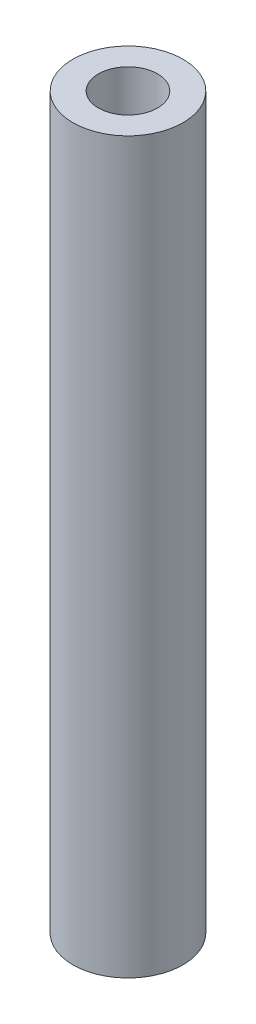
ISO-10303-21;
HEADER;
FILE_DESCRIPTION(('STEP AP214'),'2;1');
FILE_NAME('part.step','',(''),(''),'','','');
FILE_SCHEMA(('AUTOMOTIVE_DESIGN { 1 0 10303 214 1 1 1 1 }'));
ENDSEC;
DATA;
#1=APPLICATION_CONTEXT('core data for automotive mechanical design processes');
#2=APPLICATION_PROTOCOL_DEFINITION('international standard','automotive_design',2000,#1);
#3=PRODUCT_CONTEXT('',#1,'mechanical');
#4=PRODUCT('Part','Part','',(#3));
#5=PRODUCT_RELATED_PRODUCT_CATEGORY('part','',(#4));
#6=PRODUCT_DEFINITION_FORMATION('','',#4);
#7=PRODUCT_DEFINITION_CONTEXT('part definition',#1,'design');
#8=PRODUCT_DEFINITION('design','',#6,#7);
#9=PRODUCT_DEFINITION_SHAPE('','',#8);
#10=(LENGTH_UNIT() NAMED_UNIT(*) SI_UNIT(.MILLI.,.METRE.));
#11=(NAMED_UNIT(*) PLANE_ANGLE_UNIT() SI_UNIT($,.RADIAN.));
#12=(NAMED_UNIT(*) SI_UNIT($,.STERADIAN.) SOLID_ANGLE_UNIT());
#13=UNCERTAINTY_MEASURE_WITH_UNIT(LENGTH_MEASURE(1.E-05),#10,'distance_accuracy_value','');
#14=(GEOMETRIC_REPRESENTATION_CONTEXT(3) GLOBAL_UNCERTAINTY_ASSIGNED_CONTEXT((#13)) GLOBAL_UNIT_ASSIGNED_CONTEXT((#10,
#11,#12)) REPRESENTATION_CONTEXT('',''));
#15=CARTESIAN_POINT('',(0.,0.,0.));
#16=DIRECTION('',(0.,0.,1.));
#17=DIRECTION('',(1.,0.,0.));
#18=AXIS2_PLACEMENT_3D('',#15,#16,#17);
#19=CARTESIAN_POINT('',(0.,53.,0.));
#20=DIRECTION('',(0.,1.,0.));
#21=DIRECTION('',(0.,0.,1.));
#22=AXIS2_PLACEMENT_3D('',#19,#20,#21);
#23=PLANE('',#22);
#24=CARTESIAN_POINT('',(0.,53.,0.));
#25=DIRECTION('',(0.,1.,0.));
#26=DIRECTION('',(0.,0.,1.));
#27=AXIS2_PLACEMENT_3D('',#24,#25,#26);
#28=CIRCLE('',#27,4.);
#29=CARTESIAN_POINT('',(0.,53.,4.));
#30=VERTEX_POINT('',#29);
#31=EDGE_CURVE('E10',#30,#30,#28,.T.);
#32=ORIENTED_EDGE('',*,*,#31,.T.);
#33=EDGE_LOOP('',(#32));
#34=FACE_BOUND('',#33,.T.);
#35=CARTESIAN_POINT('',(0.,53.,0.));
#36=DIRECTION('',(0.,1.,0.));
#37=DIRECTION('',(0.,0.,1.));
#38=AXIS2_PLACEMENT_3D('',#35,#36,#37);
#39=CIRCLE('',#38,2.15);
#40=CARTESIAN_POINT('',(0.,53.,2.15));
#41=VERTEX_POINT('',#40);
#42=EDGE_CURVE('E56',#41,#41,#39,.T.);
#43=ORIENTED_EDGE('',*,*,#42,.F.);
#44=EDGE_LOOP('',(#43));
#45=FACE_BOUND('',#44,.T.);
#46=ADVANCED_FACE('F43',(#34,#45),#23,.T.);
#47=CARTESIAN_POINT('',(0.,0.,0.));
#48=DIRECTION('',(0.,1.,0.));
#49=DIRECTION('',(0.,0.,1.));
#50=AXIS2_PLACEMENT_3D('',#47,#48,#49);
#51=PLANE('',#50);
#52=CARTESIAN_POINT('',(0.,0.,0.));
#53=DIRECTION('',(0.,1.,0.));
#54=DIRECTION('',(0.,0.,1.));
#55=AXIS2_PLACEMENT_3D('',#52,#53,#54);
#56=CIRCLE('',#55,4.);
#57=CARTESIAN_POINT('',(0.,0.,4.));
#58=VERTEX_POINT('',#57);
#59=EDGE_CURVE('E47',#58,#58,#56,.T.);
#60=ORIENTED_EDGE('',*,*,#59,.F.);
#61=EDGE_LOOP('',(#60));
#62=FACE_BOUND('',#61,.T.);
#63=CARTESIAN_POINT('',(0.,0.,0.));
#64=DIRECTION('',(0.,1.,0.));
#65=DIRECTION('',(0.,0.,1.));
#66=AXIS2_PLACEMENT_3D('',#63,#64,#65);
#67=CIRCLE('',#66,2.15);
#68=CARTESIAN_POINT('',(0.,0.,2.15));
#69=VERTEX_POINT('',#68);
#70=EDGE_CURVE('E58',#69,#69,#67,.T.);
#71=ORIENTED_EDGE('',*,*,#70,.T.);
#72=EDGE_LOOP('',(#71));
#73=FACE_BOUND('',#72,.T.);
#74=ADVANCED_FACE('F70',(#62,#73),#51,.F.);
#75=CARTESIAN_POINT('',(0.,53.,0.));
#76=DIRECTION('',(0.,-1.,0.));
#77=DIRECTION('',(0.,0.,-1.));
#78=AXIS2_PLACEMENT_3D('',#75,#76,#77);
#79=CYLINDRICAL_SURFACE('',#78,4.);
#80=ORIENTED_EDGE('',*,*,#31,.F.);
#81=EDGE_LOOP('',(#80));
#82=FACE_BOUND('',#81,.T.);
#83=ORIENTED_EDGE('',*,*,#59,.T.);
#84=EDGE_LOOP('',(#83));
#85=FACE_BOUND('',#84,.T.);
#86=ADVANCED_FACE('F45',(#82,#85),#79,.T.);
#87=CARTESIAN_POINT('',(0.,53.,0.));
#88=DIRECTION('',(0.,-1.,0.));
#89=DIRECTION('',(0.,0.,-1.));
#90=AXIS2_PLACEMENT_3D('',#87,#88,#89);
#91=CYLINDRICAL_SURFACE('',#90,2.15);
#92=ORIENTED_EDGE('',*,*,#42,.T.);
#93=EDGE_LOOP('',(#92));
#94=FACE_BOUND('',#93,.T.);
#95=ORIENTED_EDGE('',*,*,#70,.F.);
#96=EDGE_LOOP('',(#95));
#97=FACE_BOUND('',#96,.T.);
#98=ADVANCED_FACE('F66',(#94,#97),#91,.F.);
#99=CLOSED_SHELL('',(#46,#74,#86,#98));
#100=MANIFOLD_SOLID_BREP('B2',#99);
#101=ADVANCED_BREP_SHAPE_REPRESENTATION('',(#18,#100),#14);
#102=SHAPE_DEFINITION_REPRESENTATION(#9,#101);
ENDSEC;
END-ISO-10303-21;
